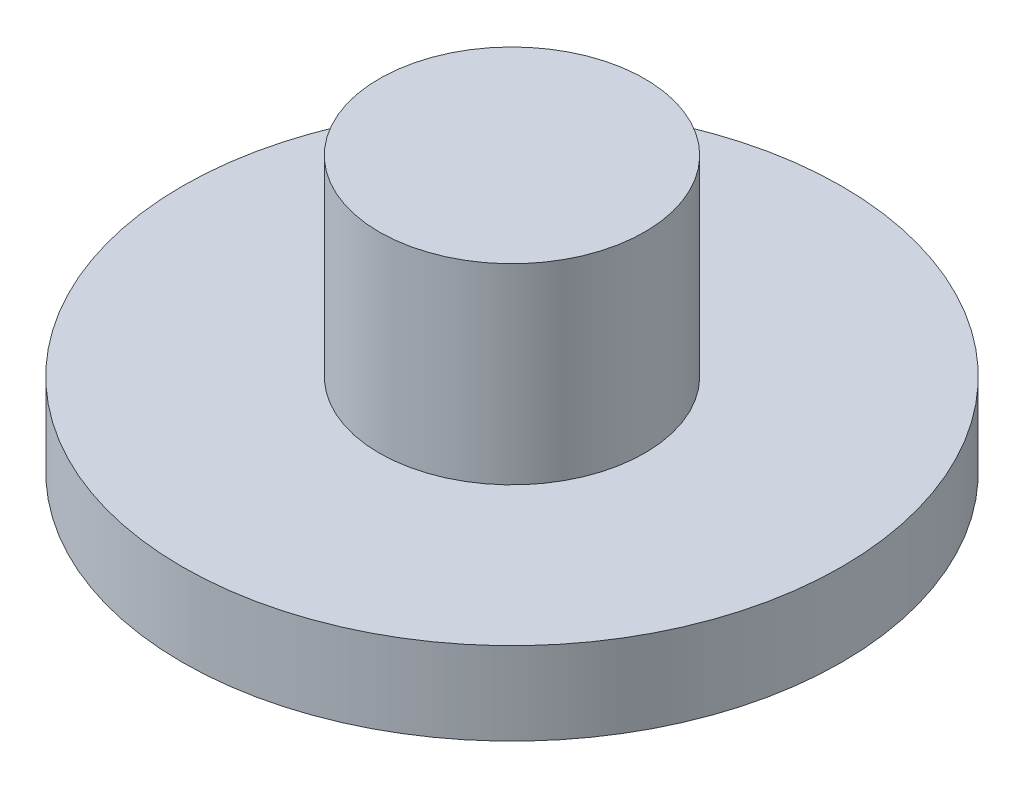
ISO-10303-21;
HEADER;
FILE_DESCRIPTION(('STEP AP214'),'2;1');
FILE_NAME('part.step','',(''),(''),'','','');
FILE_SCHEMA(('AUTOMOTIVE_DESIGN { 1 0 10303 214 1 1 1 1 }'));
ENDSEC;
DATA;
#1=APPLICATION_CONTEXT('core data for automotive mechanical design processes');
#2=APPLICATION_PROTOCOL_DEFINITION('international standard','automotive_design',2000,#1);
#3=PRODUCT_CONTEXT('',#1,'mechanical');
#4=PRODUCT('Part','Part','',(#3));
#5=PRODUCT_RELATED_PRODUCT_CATEGORY('part','',(#4));
#6=PRODUCT_DEFINITION_FORMATION('','',#4);
#7=PRODUCT_DEFINITION_CONTEXT('part definition',#1,'design');
#8=PRODUCT_DEFINITION('design','',#6,#7);
#9=PRODUCT_DEFINITION_SHAPE('','',#8);
#10=(LENGTH_UNIT() NAMED_UNIT(*) SI_UNIT(.MILLI.,.METRE.));
#11=(NAMED_UNIT(*) PLANE_ANGLE_UNIT() SI_UNIT($,.RADIAN.));
#12=(NAMED_UNIT(*) SI_UNIT($,.STERADIAN.) SOLID_ANGLE_UNIT());
#13=UNCERTAINTY_MEASURE_WITH_UNIT(LENGTH_MEASURE(1.E-05),#10,'distance_accuracy_value','');
#14=(GEOMETRIC_REPRESENTATION_CONTEXT(3) GLOBAL_UNCERTAINTY_ASSIGNED_CONTEXT((#13)) GLOBAL_UNIT_ASSIGNED_CONTEXT((#10,
#11,#12)) REPRESENTATION_CONTEXT('',''));
#15=CARTESIAN_POINT('',(0.,0.,0.));
#16=DIRECTION('',(0.,0.,1.));
#17=DIRECTION('',(1.,0.,0.));
#18=AXIS2_PLACEMENT_3D('',#15,#16,#17);
#19=CARTESIAN_POINT('',(0.,1.9,0.));
#20=DIRECTION('',(0.,-1.,0.));
#21=DIRECTION('',(0.,0.,-1.));
#22=AXIS2_PLACEMENT_3D('',#19,#20,#21);
#23=CYLINDRICAL_SURFACE('',#22,7.575);
#24=CARTESIAN_POINT('',(0.,1.9,0.));
#25=DIRECTION('',(0.,1.,0.));
#26=DIRECTION('',(0.,0.,1.));
#27=AXIS2_PLACEMENT_3D('',#24,#25,#26);
#28=CIRCLE('',#27,7.575);
#29=CARTESIAN_POINT('',(0.,1.9,-7.575));
#30=VERTEX_POINT('',#29);
#31=EDGE_CURVE('E41',#30,#30,#28,.T.);
#32=CARTESIAN_POINT('',(0.,0.,0.));
#33=DIRECTION('',(0.,1.,0.));
#34=DIRECTION('',(0.,0.,1.));
#35=AXIS2_PLACEMENT_3D('',#32,#33,#34);
#36=CIRCLE('',#35,7.575);
#37=CARTESIAN_POINT('',(0.,0.,-7.575));
#38=VERTEX_POINT('',#37);
#39=EDGE_CURVE('E37',#38,#38,#36,.T.);
#40=CARTESIAN_POINT('',(0.,1.9,-7.575));
#41=CARTESIAN_POINT('',(0.,1.88020833333333,-7.575));
#42=CARTESIAN_POINT('',(0.,1.86041666666667,-7.575));
#43=CARTESIAN_POINT('',(0.,1.82083333333333,-7.575));
#44=CARTESIAN_POINT('',(0.,1.80104166666667,-7.575));
#45=CARTESIAN_POINT('',(0.,1.76145833333333,-7.575));
#46=CARTESIAN_POINT('',(0.,1.74166666666667,-7.575));
#47=CARTESIAN_POINT('',(0.,1.70208333333333,-7.575));
#48=CARTESIAN_POINT('',(0.,1.68229166666667,-7.575));
#49=CARTESIAN_POINT('',(0.,1.64270833333333,-7.575));
#50=CARTESIAN_POINT('',(0.,1.62291666666667,-7.575));
#51=CARTESIAN_POINT('',(0.,1.58333333333333,-7.575));
#52=CARTESIAN_POINT('',(0.,1.56354166666667,-7.575));
#53=CARTESIAN_POINT('',(0.,1.52395833333333,-7.575));
#54=CARTESIAN_POINT('',(0.,1.50416666666667,-7.575));
#55=CARTESIAN_POINT('',(0.,1.46458333333333,-7.575));
#56=CARTESIAN_POINT('',(0.,1.44479166666667,-7.575));
#57=CARTESIAN_POINT('',(0.,1.40520833333333,-7.575));
#58=CARTESIAN_POINT('',(0.,1.38541666666667,-7.575));
#59=CARTESIAN_POINT('',(0.,1.34583333333333,-7.575));
#60=CARTESIAN_POINT('',(0.,1.32604166666667,-7.575));
#61=CARTESIAN_POINT('',(0.,1.28645833333333,-7.575));
#62=CARTESIAN_POINT('',(0.,1.26666666666667,-7.575));
#63=CARTESIAN_POINT('',(0.,1.22708333333333,-7.575));
#64=CARTESIAN_POINT('',(0.,1.20729166666667,-7.575));
#65=CARTESIAN_POINT('',(0.,1.16770833333333,-7.575));
#66=CARTESIAN_POINT('',(0.,1.14791666666667,-7.575));
#67=CARTESIAN_POINT('',(0.,1.10833333333333,-7.575));
#68=CARTESIAN_POINT('',(0.,1.08854166666667,-7.575));
#69=CARTESIAN_POINT('',(0.,1.04895833333333,-7.575));
#70=CARTESIAN_POINT('',(0.,1.02916666666667,-7.575));
#71=CARTESIAN_POINT('',(0.,0.989583333333333,-7.575));
#72=CARTESIAN_POINT('',(0.,0.969791666666667,-7.575));
#73=CARTESIAN_POINT('',(0.,0.930208333333333,-7.575));
#74=CARTESIAN_POINT('',(0.,0.910416666666667,-7.575));
#75=CARTESIAN_POINT('',(0.,0.870833333333333,-7.575));
#76=CARTESIAN_POINT('',(0.,0.851041666666667,-7.575));
#77=CARTESIAN_POINT('',(0.,0.811458333333333,-7.575));
#78=CARTESIAN_POINT('',(0.,0.791666666666667,-7.575));
#79=CARTESIAN_POINT('',(0.,0.752083333333333,-7.575));
#80=CARTESIAN_POINT('',(0.,0.732291666666667,-7.575));
#81=CARTESIAN_POINT('',(0.,0.692708333333333,-7.575));
#82=CARTESIAN_POINT('',(0.,0.672916666666667,-7.575));
#83=CARTESIAN_POINT('',(0.,0.633333333333333,-7.575));
#84=CARTESIAN_POINT('',(0.,0.613541666666667,-7.575));
#85=CARTESIAN_POINT('',(0.,0.573958333333333,-7.575));
#86=CARTESIAN_POINT('',(0.,0.554166666666667,-7.575));
#87=CARTESIAN_POINT('',(0.,0.514583333333333,-7.575));
#88=CARTESIAN_POINT('',(0.,0.494791666666667,-7.575));
#89=CARTESIAN_POINT('',(0.,0.455208333333333,-7.575));
#90=CARTESIAN_POINT('',(0.,0.435416666666667,-7.575));
#91=CARTESIAN_POINT('',(0.,0.395833333333333,-7.575));
#92=CARTESIAN_POINT('',(0.,0.376041666666667,-7.575));
#93=CARTESIAN_POINT('',(0.,0.336458333333333,-7.575));
#94=CARTESIAN_POINT('',(0.,0.316666666666667,-7.575));
#95=CARTESIAN_POINT('',(0.,0.277083333333333,-7.575));
#96=CARTESIAN_POINT('',(0.,0.257291666666667,-7.575));
#97=CARTESIAN_POINT('',(0.,0.217708333333333,-7.575));
#98=CARTESIAN_POINT('',(0.,0.197916666666667,-7.575));
#99=CARTESIAN_POINT('',(0.,0.158333333333333,-7.575));
#100=CARTESIAN_POINT('',(0.,0.138541666666667,-7.575));
#101=CARTESIAN_POINT('',(0.,0.0989583333333333,-7.575));
#102=CARTESIAN_POINT('',(0.,0.0791666666666666,-7.575));
#103=CARTESIAN_POINT('',(0.,0.0395833333333333,-7.575));
#104=CARTESIAN_POINT('',(0.,0.0197916666666666,-7.575));
#105=CARTESIAN_POINT('',(0.,0.,-7.575));
#106=B_SPLINE_CURVE_WITH_KNOTS('',3,(#40,#41,#42,#43,#44,#45,#46,#47,#48,#49,#50,#51,#52,#53,
#54,#55,#56,#57,#58,#59,#60,#61,#62,#63,#64,#65,#66,#67,#68,#69,#70,#71,#72,#73,#74,#75,#76,#77,
#78,#79,#80,#81,#82,#83,#84,#85,#86,#87,#88,#89,#90,#91,#92,#93,#94,#95,#96,#97,#98,#99,#100,
#101,#102,#103,#104,#105),.UNSPECIFIED.,.F.,.F.,(4,2,2,2,2,2,2,2,2,2,2,2,2,2,2,2,2,2,2,2,2,2,2,
2,2,2,2,2,2,2,2,2,4),(0.,0.059375,0.11875,0.178125,0.2375,0.296875,0.35625,0.415625,0.475,
0.534375,0.59375,0.653125,0.7125,0.771875,0.83125,0.890625,0.95,1.009375,1.06875,1.128125,
1.1875,1.246875,1.30625,1.365625,1.425,1.484375,1.54375,1.603125,1.6625,1.721875,1.78125,
1.840625,1.9),.UNSPECIFIED.);
#107=EDGE_CURVE('BSEAM34',#30,#38,#106,.T.);
#108=ORIENTED_EDGE('',*,*,#31,.F.);
#109=ORIENTED_EDGE('',*,*,#39,.T.);
#110=ORIENTED_EDGE('',*,*,#107,.T.);
#111=ORIENTED_EDGE('',*,*,#107,.F.);
#112=EDGE_LOOP('',(#108,#110,#109,#111));
#113=FACE_BOUND('',#112,.T.);
#114=ADVANCED_FACE('F34',(#113),#23,.T.);
#115=CARTESIAN_POINT('',(0.,1.9,0.));
#116=DIRECTION('',(0.,1.,0.));
#117=DIRECTION('',(0.,0.,1.));
#118=AXIS2_PLACEMENT_3D('',#115,#116,#117);
#119=PLANE('',#118);
#120=CARTESIAN_POINT('',(0.,1.9,0.));
#121=DIRECTION('',(0.,1.,0.));
#122=DIRECTION('',(0.,0.,1.));
#123=AXIS2_PLACEMENT_3D('',#120,#121,#122);
#124=CIRCLE('',#123,3.05);
#125=CARTESIAN_POINT('',(0.,1.9,3.05));
#126=VERTEX_POINT('',#125);
#127=EDGE_CURVE('E10',#126,#126,#124,.T.);
#128=ORIENTED_EDGE('',*,*,#127,.F.);
#129=EDGE_LOOP('',(#128));
#130=FACE_BOUND('',#129,.T.);
#131=ORIENTED_EDGE('',*,*,#31,.T.);
#132=EDGE_LOOP('',(#131));
#133=FACE_BOUND('',#132,.T.);
#134=ADVANCED_FACE('F58',(#130,#133),#119,.T.);
#135=CARTESIAN_POINT('',(0.,0.,0.));
#136=DIRECTION('',(0.,1.,0.));
#137=DIRECTION('',(0.,0.,1.));
#138=AXIS2_PLACEMENT_3D('',#135,#136,#137);
#139=PLANE('',#138);
#140=ORIENTED_EDGE('',*,*,#39,.F.);
#141=EDGE_LOOP('',(#140));
#142=FACE_BOUND('',#141,.T.);
#143=ADVANCED_FACE('F55',(#142),#139,.F.);
#144=CARTESIAN_POINT('',(0.,6.3,0.));
#145=DIRECTION('',(0.,-1.,0.));
#146=DIRECTION('',(0.,0.,-1.));
#147=AXIS2_PLACEMENT_3D('',#144,#145,#146);
#148=CYLINDRICAL_SURFACE('',#147,3.05);
#149=CARTESIAN_POINT('',(0.,6.3,0.));
#150=DIRECTION('',(0.,1.,0.));
#151=DIRECTION('',(0.,0.,1.));
#152=AXIS2_PLACEMENT_3D('',#149,#150,#151);
#153=CIRCLE('',#152,3.05);
#154=CARTESIAN_POINT('',(0.,6.3,3.05));
#155=VERTEX_POINT('',#154);
#156=EDGE_CURVE('E47',#155,#155,#153,.T.);
#157=ORIENTED_EDGE('',*,*,#156,.F.);
#158=EDGE_LOOP('',(#157));
#159=FACE_BOUND('',#158,.T.);
#160=ORIENTED_EDGE('',*,*,#127,.T.);
#161=EDGE_LOOP('',(#160));
#162=FACE_BOUND('',#161,.T.);
#163=ADVANCED_FACE('F57',(#159,#162),#148,.T.);
#164=CARTESIAN_POINT('',(0.,6.3,0.));
#165=DIRECTION('',(0.,1.,0.));
#166=DIRECTION('',(0.,0.,1.));
#167=AXIS2_PLACEMENT_3D('',#164,#165,#166);
#168=PLANE('',#167);
#169=ORIENTED_EDGE('',*,*,#156,.T.);
#170=EDGE_LOOP('',(#169));
#171=FACE_BOUND('',#170,.T.);
#172=ADVANCED_FACE('F63',(#171),#168,.T.);
#173=CLOSED_SHELL('',(#114,#134,#143,#163,#172));
#174=MANIFOLD_SOLID_BREP('B2',#173);
#175=ADVANCED_BREP_SHAPE_REPRESENTATION('',(#18,#174),#14);
#176=SHAPE_DEFINITION_REPRESENTATION(#9,#175);
ENDSEC;
END-ISO-10303-21;
